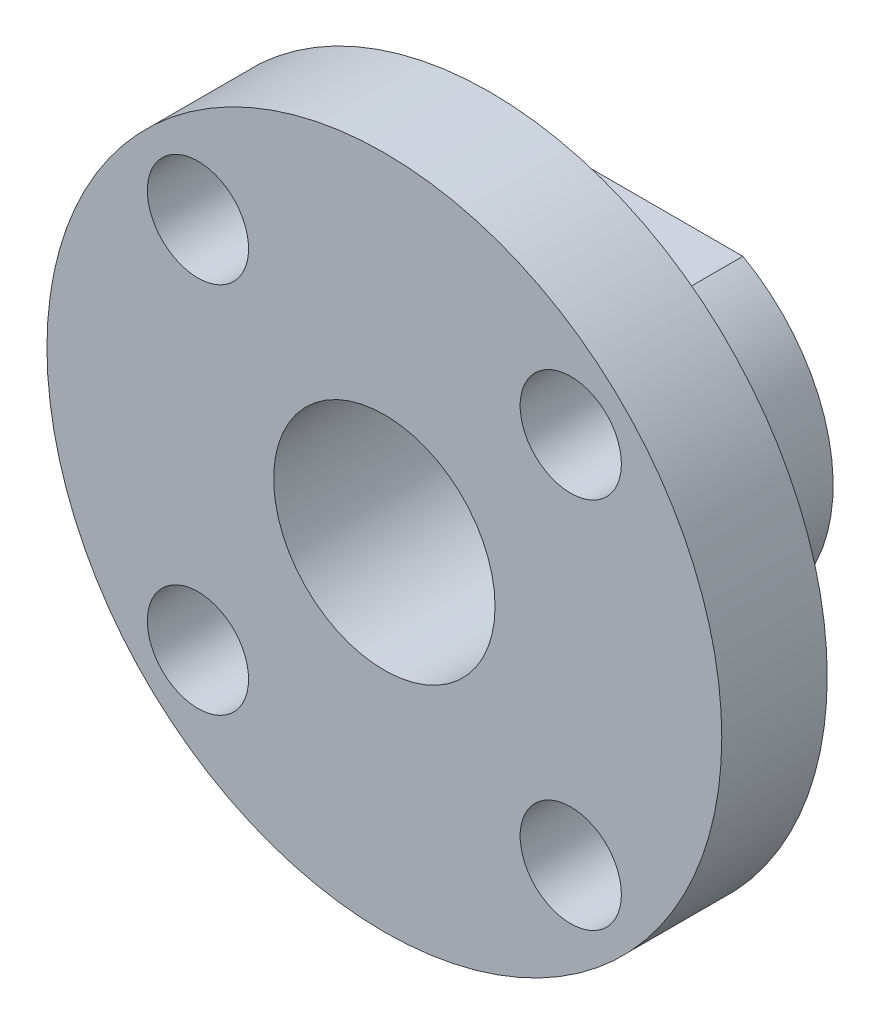
ISO-10303-21;
HEADER;
FILE_DESCRIPTION(('STEP AP214'),'2;1');
FILE_NAME('part.step','',(''),(''),'','','');
FILE_SCHEMA(('AUTOMOTIVE_DESIGN { 1 0 10303 214 1 1 1 1 }'));
ENDSEC;
DATA;
#1=APPLICATION_CONTEXT('core data for automotive mechanical design processes');
#2=APPLICATION_PROTOCOL_DEFINITION('international standard','automotive_design',2000,#1);
#3=PRODUCT_CONTEXT('',#1,'mechanical');
#4=PRODUCT('Part','Part','',(#3));
#5=PRODUCT_RELATED_PRODUCT_CATEGORY('part','',(#4));
#6=PRODUCT_DEFINITION_FORMATION('','',#4);
#7=PRODUCT_DEFINITION_CONTEXT('part definition',#1,'design');
#8=PRODUCT_DEFINITION('design','',#6,#7);
#9=PRODUCT_DEFINITION_SHAPE('','',#8);
#10=(LENGTH_UNIT() NAMED_UNIT(*) SI_UNIT(.MILLI.,.METRE.));
#11=(NAMED_UNIT(*) PLANE_ANGLE_UNIT() SI_UNIT($,.RADIAN.));
#12=(NAMED_UNIT(*) SI_UNIT($,.STERADIAN.) SOLID_ANGLE_UNIT());
#13=UNCERTAINTY_MEASURE_WITH_UNIT(LENGTH_MEASURE(1.E-05),#10,'distance_accuracy_value','');
#14=(GEOMETRIC_REPRESENTATION_CONTEXT(3) GLOBAL_UNCERTAINTY_ASSIGNED_CONTEXT((#13)) GLOBAL_UNIT_ASSIGNED_CONTEXT((#10,
#11,#12)) REPRESENTATION_CONTEXT('',''));
#15=CARTESIAN_POINT('',(0.,0.,0.));
#16=DIRECTION('',(0.,0.,1.));
#17=DIRECTION('',(1.,0.,0.));
#18=AXIS2_PLACEMENT_3D('',#15,#16,#17);
#19=CARTESIAN_POINT('',(0.,0.,5.));
#20=DIRECTION('',(0.,0.,-1.));
#21=DIRECTION('',(-1.,0.,0.));
#22=AXIS2_PLACEMENT_3D('',#19,#20,#21);
#23=CYLINDRICAL_SURFACE('',#22,16.);
#24=CARTESIAN_POINT('',(0.,0.,5.));
#25=DIRECTION('',(0.,0.,1.));
#26=DIRECTION('',(1.,0.,0.));
#27=AXIS2_PLACEMENT_3D('',#24,#25,#26);
#28=CIRCLE('',#27,16.);
#29=CARTESIAN_POINT('',(16.,0.,5.));
#30=VERTEX_POINT('',#29);
#31=EDGE_CURVE('E11',#30,#30,#28,.T.);
#32=ORIENTED_EDGE('',*,*,#31,.F.);
#33=EDGE_LOOP('',(#32));
#34=FACE_BOUND('',#33,.T.);
#35=CARTESIAN_POINT('',(0.,0.,0.));
#36=DIRECTION('',(0.,0.,1.));
#37=DIRECTION('',(1.,0.,0.));
#38=AXIS2_PLACEMENT_3D('',#35,#36,#37);
#39=CIRCLE('',#38,16.);
#40=CARTESIAN_POINT('',(16.,0.,0.));
#41=VERTEX_POINT('',#40);
#42=EDGE_CURVE('E42',#41,#41,#39,.T.);
#43=ORIENTED_EDGE('',*,*,#42,.T.);
#44=EDGE_LOOP('',(#43));
#45=FACE_BOUND('',#44,.T.);
#46=ADVANCED_FACE('F34',(#34,#45),#23,.T.);
#47=CARTESIAN_POINT('',(0.,0.,5.));
#48=DIRECTION('',(0.,0.,1.));
#49=DIRECTION('',(1.,0.,0.));
#50=AXIS2_PLACEMENT_3D('',#47,#48,#49);
#51=PLANE('',#50);
#52=CARTESIAN_POINT('',(0.,0.,5.));
#53=DIRECTION('',(0.,0.,1.));
#54=DIRECTION('',(1.,0.,0.));
#55=AXIS2_PLACEMENT_3D('',#52,#53,#54);
#56=CIRCLE('',#55,5.25);
#57=CARTESIAN_POINT('',(5.25,0.,5.));
#58=VERTEX_POINT('',#57);
#59=EDGE_CURVE('E76',#58,#58,#56,.T.);
#60=ORIENTED_EDGE('',*,*,#59,.F.);
#61=EDGE_LOOP('',(#60));
#62=FACE_BOUND('',#61,.T.);
#63=CARTESIAN_POINT('',(-8.83883476483184,8.83883476483184,5.));
#64=DIRECTION('',(0.,0.,1.));
#65=DIRECTION('',(1.,0.,0.));
#66=AXIS2_PLACEMENT_3D('',#63,#64,#65);
#67=CIRCLE('',#66,2.4);
#68=CARTESIAN_POINT('',(-6.43883476483184,8.83883476483184,5.));
#69=VERTEX_POINT('',#68);
#70=EDGE_CURVE('E94',#69,#69,#67,.T.);
#71=ORIENTED_EDGE('',*,*,#70,.F.);
#72=EDGE_LOOP('',(#71));
#73=FACE_BOUND('',#72,.T.);
#74=CARTESIAN_POINT('',(8.83883476483185,-8.83883476483184,5.));
#75=DIRECTION('',(0.,0.,1.));
#76=DIRECTION('',(1.,0.,0.));
#77=AXIS2_PLACEMENT_3D('',#74,#75,#76);
#78=CIRCLE('',#77,2.4);
#79=CARTESIAN_POINT('',(11.2388347648318,-8.83883476483184,5.));
#80=VERTEX_POINT('',#79);
#81=EDGE_CURVE('E95',#80,#80,#78,.T.);
#82=ORIENTED_EDGE('',*,*,#81,.F.);
#83=EDGE_LOOP('',(#82));
#84=FACE_BOUND('',#83,.T.);
#85=CARTESIAN_POINT('',(-8.83883476483184,-8.83883476483185,5.));
#86=DIRECTION('',(0.,0.,1.));
#87=DIRECTION('',(1.,0.,0.));
#88=AXIS2_PLACEMENT_3D('',#85,#86,#87);
#89=CIRCLE('',#88,2.4);
#90=CARTESIAN_POINT('',(-6.43883476483184,-8.83883476483185,5.));
#91=VERTEX_POINT('',#90);
#92=EDGE_CURVE('E87',#91,#91,#89,.T.);
#93=ORIENTED_EDGE('',*,*,#92,.F.);
#94=EDGE_LOOP('',(#93));
#95=FACE_BOUND('',#94,.T.);
#96=CARTESIAN_POINT('',(8.83883476483184,8.83883476483185,5.));
#97=DIRECTION('',(0.,0.,1.));
#98=DIRECTION('',(1.,0.,0.));
#99=AXIS2_PLACEMENT_3D('',#96,#97,#98);
#100=CIRCLE('',#99,2.4);
#101=CARTESIAN_POINT('',(11.2388347648318,8.83883476483185,5.));
#102=VERTEX_POINT('',#101);
#103=EDGE_CURVE('E105',#102,#102,#100,.T.);
#104=ORIENTED_EDGE('',*,*,#103,.F.);
#105=EDGE_LOOP('',(#104));
#106=FACE_BOUND('',#105,.T.);
#107=ORIENTED_EDGE('',*,*,#31,.T.);
#108=EDGE_LOOP('',(#107));
#109=FACE_BOUND('',#108,.T.);
#110=ADVANCED_FACE('F113',(#62,#73,#84,#95,#106,#109),#51,.T.);
#111=CARTESIAN_POINT('',(0.,0.,0.));
#112=DIRECTION('',(0.,0.,1.));
#113=DIRECTION('',(1.,0.,0.));
#114=AXIS2_PLACEMENT_3D('',#111,#112,#113);
#115=PLANE('',#114);
#116=DIRECTION('',(-1.,0.,0.));
#117=VECTOR('',#116,1.);
#118=CARTESIAN_POINT('',(4.,7.25,0.));
#119=LINE('',#118,#117);
#120=CARTESIAN_POINT('',(4.,7.25,0.));
#121=VERTEX_POINT('',#120);
#122=CARTESIAN_POINT('',(-4.,7.25,0.));
#123=VERTEX_POINT('',#122);
#124=EDGE_CURVE('E70',#121,#123,#119,.T.);
#125=ORIENTED_EDGE('',*,*,#124,.T.);
#126=CARTESIAN_POINT('',(0.,0.,0.));
#127=DIRECTION('',(0.,0.,1.));
#128=DIRECTION('',(1.,0.,0.));
#129=AXIS2_PLACEMENT_3D('',#126,#127,#128);
#130=CIRCLE('',#129,8.2802475808396);
#131=EDGE_CURVE('E50',#123,#121,#130,.T.);
#132=ORIENTED_EDGE('',*,*,#131,.T.);
#133=EDGE_LOOP('',(#125,#132));
#134=FACE_BOUND('',#133,.T.);
#135=CARTESIAN_POINT('',(-8.83883476483184,8.83883476483184,0.));
#136=DIRECTION('',(0.,0.,1.));
#137=DIRECTION('',(1.,0.,0.));
#138=AXIS2_PLACEMENT_3D('',#135,#136,#137);
#139=CIRCLE('',#138,2.4);
#140=CARTESIAN_POINT('',(-6.43883476483184,8.83883476483184,0.));
#141=VERTEX_POINT('',#140);
#142=EDGE_CURVE('E91',#141,#141,#139,.T.);
#143=ORIENTED_EDGE('',*,*,#142,.T.);
#144=EDGE_LOOP('',(#143));
#145=FACE_BOUND('',#144,.T.);
#146=CARTESIAN_POINT('',(8.83883476483185,-8.83883476483184,0.));
#147=DIRECTION('',(0.,0.,1.));
#148=DIRECTION('',(1.,0.,0.));
#149=AXIS2_PLACEMENT_3D('',#146,#147,#148);
#150=CIRCLE('',#149,2.4);
#151=CARTESIAN_POINT('',(11.2388347648318,-8.83883476483184,0.));
#152=VERTEX_POINT('',#151);
#153=EDGE_CURVE('E90',#152,#152,#150,.T.);
#154=ORIENTED_EDGE('',*,*,#153,.T.);
#155=EDGE_LOOP('',(#154));
#156=FACE_BOUND('',#155,.T.);
#157=CARTESIAN_POINT('',(-8.83883476483184,-8.83883476483185,0.));
#158=DIRECTION('',(0.,0.,1.));
#159=DIRECTION('',(1.,0.,0.));
#160=AXIS2_PLACEMENT_3D('',#157,#158,#159);
#161=CIRCLE('',#160,2.4);
#162=CARTESIAN_POINT('',(-6.43883476483184,-8.83883476483185,0.));
#163=VERTEX_POINT('',#162);
#164=EDGE_CURVE('E83',#163,#163,#161,.T.);
#165=ORIENTED_EDGE('',*,*,#164,.T.);
#166=EDGE_LOOP('',(#165));
#167=FACE_BOUND('',#166,.T.);
#168=CARTESIAN_POINT('',(8.83883476483184,8.83883476483185,0.));
#169=DIRECTION('',(0.,0.,1.));
#170=DIRECTION('',(1.,0.,0.));
#171=AXIS2_PLACEMENT_3D('',#168,#169,#170);
#172=CIRCLE('',#171,2.4);
#173=CARTESIAN_POINT('',(11.2388347648318,8.83883476483185,0.));
#174=VERTEX_POINT('',#173);
#175=EDGE_CURVE('E98',#174,#174,#172,.T.);
#176=ORIENTED_EDGE('',*,*,#175,.T.);
#177=EDGE_LOOP('',(#176));
#178=FACE_BOUND('',#177,.T.);
#179=ORIENTED_EDGE('',*,*,#42,.F.);
#180=EDGE_LOOP('',(#179));
#181=FACE_BOUND('',#180,.T.);
#182=ADVANCED_FACE('F74',(#134,#145,#156,#167,#178,#181),#115,.F.);
#183=CARTESIAN_POINT('',(8.83883476483184,8.83883476483185,5.001));
#184=DIRECTION('',(0.,0.,-1.));
#185=DIRECTION('',(-1.,0.,0.));
#186=AXIS2_PLACEMENT_3D('',#183,#184,#185);
#187=CYLINDRICAL_SURFACE('',#186,2.4);
#188=ORIENTED_EDGE('',*,*,#103,.T.);
#189=EDGE_LOOP('',(#188));
#190=FACE_BOUND('',#189,.T.);
#191=ORIENTED_EDGE('',*,*,#175,.F.);
#192=EDGE_LOOP('',(#191));
#193=FACE_BOUND('',#192,.T.);
#194=ADVANCED_FACE('F112',(#190,#193),#187,.F.);
#195=CARTESIAN_POINT('',(-8.83883476483184,-8.83883476483185,5.001));
#196=DIRECTION('',(0.,0.,-1.));
#197=DIRECTION('',(-1.,0.,0.));
#198=AXIS2_PLACEMENT_3D('',#195,#196,#197);
#199=CYLINDRICAL_SURFACE('',#198,2.4);
#200=ORIENTED_EDGE('',*,*,#92,.T.);
#201=EDGE_LOOP('',(#200));
#202=FACE_BOUND('',#201,.T.);
#203=ORIENTED_EDGE('',*,*,#164,.F.);
#204=EDGE_LOOP('',(#203));
#205=FACE_BOUND('',#204,.T.);
#206=ADVANCED_FACE('F118',(#202,#205),#199,.F.);
#207=CARTESIAN_POINT('',(8.83883476483185,-8.83883476483184,5.001));
#208=DIRECTION('',(0.,0.,-1.));
#209=DIRECTION('',(-1.,0.,0.));
#210=AXIS2_PLACEMENT_3D('',#207,#208,#209);
#211=CYLINDRICAL_SURFACE('',#210,2.4);
#212=ORIENTED_EDGE('',*,*,#81,.T.);
#213=EDGE_LOOP('',(#212));
#214=FACE_BOUND('',#213,.T.);
#215=ORIENTED_EDGE('',*,*,#153,.F.);
#216=EDGE_LOOP('',(#215));
#217=FACE_BOUND('',#216,.T.);
#218=ADVANCED_FACE('F217',(#214,#217),#211,.F.);
#219=CARTESIAN_POINT('',(-8.83883476483184,8.83883476483184,5.001));
#220=DIRECTION('',(0.,0.,-1.));
#221=DIRECTION('',(-1.,0.,0.));
#222=AXIS2_PLACEMENT_3D('',#219,#220,#221);
#223=CYLINDRICAL_SURFACE('',#222,2.4);
#224=ORIENTED_EDGE('',*,*,#70,.T.);
#225=EDGE_LOOP('',(#224));
#226=FACE_BOUND('',#225,.T.);
#227=ORIENTED_EDGE('',*,*,#142,.F.);
#228=EDGE_LOOP('',(#227));
#229=FACE_BOUND('',#228,.T.);
#230=ADVANCED_FACE('F224',(#226,#229),#223,.F.);
#231=CARTESIAN_POINT('',(0.,0.,-8.));
#232=DIRECTION('',(0.,0.,1.));
#233=DIRECTION('',(1.,0.,0.));
#234=AXIS2_PLACEMENT_3D('',#231,#232,#233);
#235=CYLINDRICAL_SURFACE('',#234,8.2802475808396);
#236=ORIENTED_EDGE('',*,*,#131,.F.);
#237=DIRECTION('',(0.,0.,1.));
#238=VECTOR('',#237,1.);
#239=CARTESIAN_POINT('',(-4.,7.25,-8.));
#240=LINE('',#239,#238);
#241=CARTESIAN_POINT('',(-4.,7.25,-8.));
#242=VERTEX_POINT('',#241);
#243=EDGE_CURVE('E55',#242,#123,#240,.T.);
#244=ORIENTED_EDGE('',*,*,#243,.F.);
#245=CARTESIAN_POINT('',(0.,0.,-8.));
#246=DIRECTION('',(0.,0.,1.));
#247=DIRECTION('',(1.,0.,0.));
#248=AXIS2_PLACEMENT_3D('',#245,#246,#247);
#249=CIRCLE('',#248,8.2802475808396);
#250=CARTESIAN_POINT('',(4.,7.25,-8.));
#251=VERTEX_POINT('',#250);
#252=EDGE_CURVE('E63',#242,#251,#249,.T.);
#253=ORIENTED_EDGE('',*,*,#252,.T.);
#254=DIRECTION('',(0.,0.,1.));
#255=VECTOR('',#254,1.);
#256=CARTESIAN_POINT('',(4.,7.25,-8.));
#257=LINE('',#256,#255);
#258=EDGE_CURVE('E60',#251,#121,#257,.T.);
#259=ORIENTED_EDGE('',*,*,#258,.T.);
#260=EDGE_LOOP('',(#236,#244,#253,#259));
#261=FACE_BOUND('',#260,.T.);
#262=ADVANCED_FACE('F62',(#261),#235,.T.);
#263=CARTESIAN_POINT('',(4.,7.25,-8.));
#264=DIRECTION('',(0.,1.,0.));
#265=DIRECTION('',(0.,0.,1.));
#266=AXIS2_PLACEMENT_3D('',#263,#264,#265);
#267=PLANE('',#266);
#268=CARTESIAN_POINT('',(0.,7.25,-4.));
#269=DIRECTION('',(0.,1.,0.));
#270=DIRECTION('',(0.,0.,1.));
#271=AXIS2_PLACEMENT_3D('',#268,#269,#270);
#272=CIRCLE('',#271,2.4);
#273=CARTESIAN_POINT('',(0.,7.25,-1.6));
#274=VERTEX_POINT('',#273);
#275=EDGE_CURVE('E194',#274,#274,#272,.T.);
#276=ORIENTED_EDGE('',*,*,#275,.F.);
#277=EDGE_LOOP('',(#276));
#278=FACE_BOUND('',#277,.T.);
#279=ORIENTED_EDGE('',*,*,#124,.F.);
#280=ORIENTED_EDGE('',*,*,#258,.F.);
#281=DIRECTION('',(-1.,0.,0.));
#282=VECTOR('',#281,1.);
#283=CARTESIAN_POINT('',(4.,7.25,-8.));
#284=LINE('',#283,#282);
#285=EDGE_CURVE('E67',#251,#242,#284,.T.);
#286=ORIENTED_EDGE('',*,*,#285,.T.);
#287=ORIENTED_EDGE('',*,*,#243,.T.);
#288=EDGE_LOOP('',(#279,#280,#286,#287));
#289=FACE_BOUND('',#288,.T.);
#290=ADVANCED_FACE('F71',(#278,#289),#267,.T.);
#291=CARTESIAN_POINT('',(0.,0.,-8.));
#292=DIRECTION('',(0.,0.,1.));
#293=DIRECTION('',(1.,0.,0.));
#294=AXIS2_PLACEMENT_3D('',#291,#292,#293);
#295=PLANE('',#294);
#296=CARTESIAN_POINT('',(0.,0.,-8.));
#297=DIRECTION('',(0.,0.,1.));
#298=DIRECTION('',(1.,0.,0.));
#299=AXIS2_PLACEMENT_3D('',#296,#297,#298);
#300=CIRCLE('',#299,5.25);
#301=CARTESIAN_POINT('',(5.25,0.,-8.));
#302=VERTEX_POINT('',#301);
#303=EDGE_CURVE('E37',#302,#302,#300,.T.);
#304=ORIENTED_EDGE('',*,*,#303,.T.);
#305=EDGE_LOOP('',(#304));
#306=FACE_BOUND('',#305,.T.);
#307=ORIENTED_EDGE('',*,*,#252,.F.);
#308=ORIENTED_EDGE('',*,*,#285,.F.);
#309=EDGE_LOOP('',(#307,#308));
#310=FACE_BOUND('',#309,.T.);
#311=ADVANCED_FACE('F144',(#306,#310),#295,.F.);
#312=CARTESIAN_POINT('',(0.,0.,-10.));
#313=DIRECTION('',(0.,0.,1.));
#314=DIRECTION('',(1.,0.,0.));
#315=AXIS2_PLACEMENT_3D('',#312,#313,#314);
#316=CYLINDRICAL_SURFACE('',#315,5.25);
#317=CARTESIAN_POINT('',(0.,5.25,-1.6));
#318=CARTESIAN_POINT('',(-0.127429639884632,5.24999382323093,-1.60000753461711));
#319=CARTESIAN_POINT('',(-0.255052407627251,5.24530868430648,-1.61020938570786));
#320=CARTESIAN_POINT('',(-0.506602573324948,5.22703021493136,-1.65060482377324));
#321=CARTESIAN_POINT('',(-0.630520793799222,5.21341641418713,-1.68084435177162));
#322=CARTESIAN_POINT('',(-0.870629766471338,5.17872230636728,-1.75992904278791));
#323=CARTESIAN_POINT('',(-0.986846898923495,5.15766924044321,-1.80870637253735));
#324=CARTESIAN_POINT('',(-1.20931189875422,5.11009032670258,-1.92316915299343));
#325=CARTESIAN_POINT('',(-1.31556168945344,5.08356553789506,-1.98885133250729));
#326=CARTESIAN_POINT('',(-1.5214245356031,5.02591218711488,-2.13925603755295));
#327=CARTESIAN_POINT('',(-1.62038673907953,4.99461406833005,-2.22480363816506));
#328=CARTESIAN_POINT('',(-1.80313942467222,4.93158704938477,-2.41075456213991));
#329=CARTESIAN_POINT('',(-1.88692033387309,4.89985789088238,-2.51116718698671));
#330=CARTESIAN_POINT('',(-2.04209833905091,4.83733053685966,-2.73150137191873));
#331=CARTESIAN_POINT('',(-2.11240692814428,4.80671174097048,-2.85224608308325));
#332=CARTESIAN_POINT('',(-2.23142911041567,4.75263386578389,-3.10542962682876));
#333=CARTESIAN_POINT('',(-2.28015598791602,4.72917038491032,-3.23786120534228));
#334=CARTESIAN_POINT('',(-2.35181257009427,4.69393260798684,-3.50319973359696));
#335=CARTESIAN_POINT('',(-2.37600347851104,4.68159094874808,-3.6356874288415));
#336=CARTESIAN_POINT('',(-2.40181325067873,4.66840730085808,-3.90337076868271));
#337=CARTESIAN_POINT('',(-2.40344857898367,4.6675569240992,-4.03856436589261));
#338=CARTESIAN_POINT('',(-2.38503743756207,4.6769820912535,-4.29394468281402));
#339=CARTESIAN_POINT('',(-2.36705409748389,4.68619905216222,-4.41432778185056));
#340=CARTESIAN_POINT('',(-2.31342981408158,4.71290039348031,-4.65012999397468));
#341=CARTESIAN_POINT('',(-2.2777845897541,4.73038677824001,-4.7655478961902));
#342=CARTESIAN_POINT('',(-2.18914474871231,4.77206252325721,-4.9913101628522));
#343=CARTESIAN_POINT('',(-2.13577251566133,4.79639583906556,-5.10147847032458));
#344=CARTESIAN_POINT('',(-2.01346822435023,4.84900727722815,-5.31177686080848));
#345=CARTESIAN_POINT('',(-1.94452946253066,4.87728709709218,-5.41190259218442));
#346=CARTESIAN_POINT('',(-1.78468305975598,4.93816206593695,-5.61020439280252));
#347=CARTESIAN_POINT('',(-1.69223860300301,4.97090060433223,-5.70710159326712));
#348=CARTESIAN_POINT('',(-1.49216485611152,5.03457662620337,-5.88449618662371));
#349=CARTESIAN_POINT('',(-1.3845304590979,5.06551349899538,-5.9649880416834));
#350=CARTESIAN_POINT('',(-1.1525659632525,5.12336059349462,-6.1097095372456));
#351=CARTESIAN_POINT('',(-1.02780300889814,5.15010480691881,-6.17331686538303));
#352=CARTESIAN_POINT('',(-0.767810735101694,5.19522125611809,-6.27817404501447));
#353=CARTESIAN_POINT('',(-0.632588467062011,5.21359907573179,-6.31943881171369));
#354=CARTESIAN_POINT('',(-0.366110005016142,5.23880268688449,-6.37552731513883));
#355=CARTESIAN_POINT('',(-0.235284437250316,5.24637358812324,-6.39206076481638));
#356=CARTESIAN_POINT('',(0.0274841085985522,5.2515699743308,-6.40343910853108));
#357=CARTESIAN_POINT('',(0.159426659351411,5.24919910513341,-6.39829195324986));
#358=CARTESIAN_POINT('',(0.4119947840782,5.23524363251713,-6.36758068461112));
#359=CARTESIAN_POINT('',(0.53281356764888,5.22424174633974,-6.34330741712303));
#360=CARTESIAN_POINT('',(0.768479842005151,5.19480981631495,-6.27693450982738));
#361=CARTESIAN_POINT('',(0.883326620315851,5.17637888844965,-6.23483274849023));
#362=CARTESIAN_POINT('',(1.10784141869422,5.13309552243809,-6.13269107821133));
#363=CARTESIAN_POINT('',(1.21723904695529,5.10806195180349,-6.07213619168553));
#364=CARTESIAN_POINT('',(1.42471186320578,5.05412754676062,-5.93536869309413));
#365=CARTESIAN_POINT('',(1.52278205138539,5.02522501669498,-5.85914920778493));
#366=CARTESIAN_POINT('',(1.71358976854958,4.96356689687215,-5.68570719204083));
#367=CARTESIAN_POINT('',(1.80517121220999,4.93069234249511,-5.58725219784159));
#368=CARTESIAN_POINT('',(1.97093130351221,4.86680988147044,-5.37603141953067));
#369=CARTESIAN_POINT('',(2.04510259719978,4.83580276771606,-5.26325961895511));
#370=CARTESIAN_POINT('',(2.17579201438966,4.77846026470046,-5.02236122081838));
#371=CARTESIAN_POINT('',(2.23174841137262,4.75228272417591,-4.89388927805196));
#372=CARTESIAN_POINT('',(2.32067916043342,4.70950374091006,-4.62775565348978));
#373=CARTESIAN_POINT('',(2.35367768144335,4.69289223070327,-4.49010380371882));
#374=CARTESIAN_POINT('',(2.39314114873545,4.67288137546964,-4.22254230941568));
#375=CARTESIAN_POINT('',(2.40168449838663,4.6684485011458,-4.09301652329699));
#376=CARTESIAN_POINT('',(2.39776646450222,4.67046312989157,-3.83438553699673));
#377=CARTESIAN_POINT('',(2.38531031619933,4.67690792112966,-3.70528024002533));
#378=CARTESIAN_POINT('',(2.34159748035036,4.6989306994402,-3.46020532096686));
#379=CARTESIAN_POINT('',(2.31166110734878,4.71386550570591,-3.34393613814811));
#380=CARTESIAN_POINT('',(2.23528182344805,4.75055787771928,-3.11810742893206));
#381=CARTESIAN_POINT('',(2.18883406485859,4.77231744697459,-3.00854988413664));
#382=CARTESIAN_POINT('',(2.07728568137849,4.82196394682232,-2.79138588467572));
#383=CARTESIAN_POINT('',(2.011163307966,4.85015867216991,-2.68437629411716));
#384=CARTESIAN_POINT('',(1.86342616942243,4.9088144490236,-2.48232944029794));
#385=CARTESIAN_POINT('',(1.7818044813636,4.93927650954715,-2.38729755868222));
#386=CARTESIAN_POINT('',(1.59625267086562,5.00249416886857,-2.20258993830876));
#387=CARTESIAN_POINT('',(1.49094186412658,5.03519374563347,-2.1142739065443));
#388=CARTESIAN_POINT('',(1.26592644401351,5.09642395127411,-1.9563906349637));
#389=CARTESIAN_POINT('',(1.14621516789096,5.12495263675129,-1.88683212242008));
#390=CARTESIAN_POINT('',(0.896212440745174,5.17448869741889,-1.76938016772324));
#391=CARTESIAN_POINT('',(0.766014640465195,5.19555517818278,-1.72131564300703));
#392=CARTESIAN_POINT('',(0.565458228629997,5.21989713129126,-1.66653163690369));
#393=CARTESIAN_POINT('',(0.497785290231632,5.22679887971473,-1.65116111814205));
#394=CARTESIAN_POINT('',(0.361168282182352,5.23800875274699,-1.62631849787545));
#395=CARTESIAN_POINT('',(0.292225104788759,5.24231863137479,-1.61684240723245));
#396=CARTESIAN_POINT('',(0.185927988851842,5.24683789889941,-1.60692329204522));
#397=CARTESIAN_POINT('',(0.148801275309936,5.24802213716089,-1.60432879938568));
#398=CARTESIAN_POINT('',(0.074455205592074,5.24960409660714,-1.6008660383768));
#399=CARTESIAN_POINT('',(0.037235847907135,5.25000180489589,-1.59999779833124));
#400=CARTESIAN_POINT('',(0.,5.25,-1.6));
#401=B_SPLINE_CURVE_WITH_KNOTS('',3,(#317,#318,#319,#320,#321,#322,#323,#324,#325,#326,#327,
#328,#329,#330,#331,#332,#333,#334,#335,#336,#337,#338,#339,#340,#341,#342,#343,#344,#345,#346,
#347,#348,#349,#350,#351,#352,#353,#354,#355,#356,#357,#358,#359,#360,#361,#362,#363,#364,#365,
#366,#367,#368,#369,#370,#371,#372,#373,#374,#375,#376,#377,#378,#379,#380,#381,#382,#383,#384,
#385,#386,#387,#388,#389,#390,#391,#392,#393,#394,#395,#396,#397,#398,#399,#400),.UNSPECIFIED.,
.T.,.F.,(4,2,2,2,2,2,2,2,2,2,2,2,2,2,2,2,2,2,2,2,2,2,2,2,2,2,2,2,2,2,2,2,2,2,2,2,2,2,2,2,2,4),
(0.,0.382143558815778,0.765166316038812,1.14680080956435,1.52836150991012,1.93015876657069,
2.33220851070589,2.7591616170395,3.18585155185001,3.58928711790935,3.99242817864149,
4.35692904726784,4.72151830925649,5.0944336559986,5.46750990206864,5.87927362499262,
6.29117611460772,6.71663325910051,7.1418060302359,7.53595331471715,7.92995607063514,
8.29943319005157,8.66895428833769,9.04991498811228,9.43104320238891,9.84446764424907,
10.2580664013965,10.6834218202539,11.1083287653057,11.4958646174542,11.8833038701333,
12.2446945584682,12.6061914377108,12.9913450331204,13.3766710677156,13.7984912029647,
14.2205072603065,14.6391017157308,14.8480673468705,15.0568914032434,15.1685546406681,
15.2802197089179),.UNSPECIFIED.);
#402=CARTESIAN_POINT('',(0.,5.25,-1.6));
#403=VERTEX_POINT('',#402);
#404=EDGE_CURVE('E188',#403,#403,#401,.T.);
#405=ORIENTED_EDGE('',*,*,#404,.F.);
#406=EDGE_LOOP('',(#405));
#407=FACE_BOUND('',#406,.T.);
#408=ORIENTED_EDGE('',*,*,#59,.T.);
#409=EDGE_LOOP('',(#408));
#410=FACE_BOUND('',#409,.T.);
#411=ORIENTED_EDGE('',*,*,#303,.F.);
#412=EDGE_LOOP('',(#411));
#413=FACE_BOUND('',#412,.T.);
#414=ADVANCED_FACE('F149',(#407,#410,#413),#316,.F.);
#415=CARTESIAN_POINT('',(0.,-16.001,-4.));
#416=DIRECTION('',(0.,1.,0.));
#417=DIRECTION('',(0.,0.,1.));
#418=AXIS2_PLACEMENT_3D('',#415,#416,#417);
#419=CYLINDRICAL_SURFACE('',#418,2.4);
#420=ORIENTED_EDGE('',*,*,#275,.T.);
#421=EDGE_LOOP('',(#420));
#422=FACE_BOUND('',#421,.T.);
#423=ORIENTED_EDGE('',*,*,#404,.T.);
#424=EDGE_LOOP('',(#423));
#425=FACE_BOUND('',#424,.T.);
#426=ADVANCED_FACE('F168',(#422,#425),#419,.F.);
#427=CLOSED_SHELL('',(#46,#110,#182,#194,#206,#218,#230,#262,#290,#311,#414,#426));
#428=MANIFOLD_SOLID_BREP('B2',#427);
#429=ADVANCED_BREP_SHAPE_REPRESENTATION('',(#18,#428),#14);
#430=SHAPE_DEFINITION_REPRESENTATION(#9,#429);
ENDSEC;
END-ISO-10303-21;
